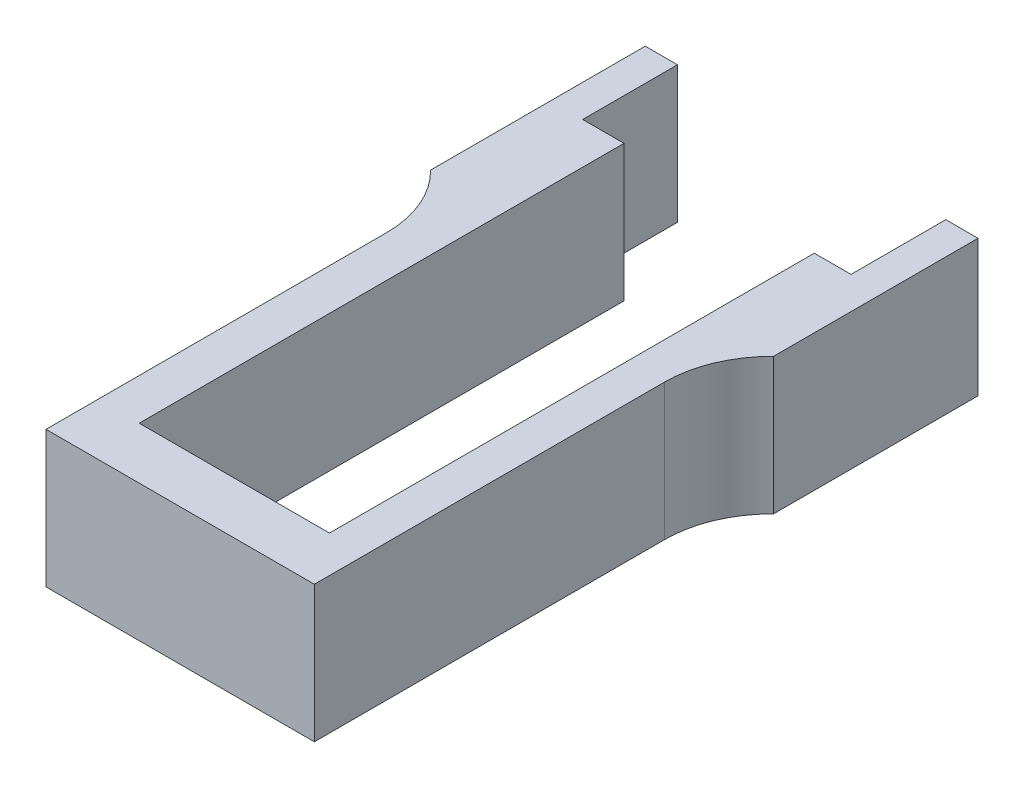
ISO-10303-21;
HEADER;
FILE_DESCRIPTION(('STEP AP214'),'2;1');
FILE_NAME('part.step','',(''),(''),'','','');
FILE_SCHEMA(('AUTOMOTIVE_DESIGN { 1 0 10303 214 1 1 1 1 }'));
ENDSEC;
DATA;
#1=APPLICATION_CONTEXT('core data for automotive mechanical design processes');
#2=APPLICATION_PROTOCOL_DEFINITION('international standard','automotive_design',2000,#1);
#3=PRODUCT_CONTEXT('',#1,'mechanical');
#4=PRODUCT('Part','Part','',(#3));
#5=PRODUCT_RELATED_PRODUCT_CATEGORY('part','',(#4));
#6=PRODUCT_DEFINITION_FORMATION('','',#4);
#7=PRODUCT_DEFINITION_CONTEXT('part definition',#1,'design');
#8=PRODUCT_DEFINITION('design','',#6,#7);
#9=PRODUCT_DEFINITION_SHAPE('','',#8);
#10=(LENGTH_UNIT() NAMED_UNIT(*) SI_UNIT(.MILLI.,.METRE.));
#11=(NAMED_UNIT(*) PLANE_ANGLE_UNIT() SI_UNIT($,.RADIAN.));
#12=(NAMED_UNIT(*) SI_UNIT($,.STERADIAN.) SOLID_ANGLE_UNIT());
#13=UNCERTAINTY_MEASURE_WITH_UNIT(LENGTH_MEASURE(1.E-05),#10,'distance_accuracy_value','');
#14=(GEOMETRIC_REPRESENTATION_CONTEXT(3) GLOBAL_UNCERTAINTY_ASSIGNED_CONTEXT((#13)) GLOBAL_UNIT_ASSIGNED_CONTEXT((#10,
#11,#12)) REPRESENTATION_CONTEXT('',''));
#15=CARTESIAN_POINT('',(0.,0.,0.));
#16=DIRECTION('',(0.,0.,1.));
#17=DIRECTION('',(1.,0.,0.));
#18=AXIS2_PLACEMENT_3D('',#15,#16,#17);
#19=CARTESIAN_POINT('',(-25.,85.5059963359212,50.));
#20=DIRECTION('',(1.,0.,0.));
#21=DIRECTION('',(0.,0.,-1.));
#22=AXIS2_PLACEMENT_3D('',#19,#20,#21);
#23=PLANE('',#22);
#24=DIRECTION('',(0.,0.,-1.));
#25=VECTOR('',#24,1.);
#26=CARTESIAN_POINT('',(-25.,85.5059963359212,50.));
#27=LINE('',#26,#25);
#28=CARTESIAN_POINT('',(-25.,85.5059963359212,50.));
#29=VERTEX_POINT('',#28);
#30=CARTESIAN_POINT('',(-25.,85.5059963359212,18.3118382249067));
#31=VERTEX_POINT('',#30);
#32=EDGE_CURVE('E255',#29,#31,#27,.T.);
#33=ORIENTED_EDGE('',*,*,#32,.T.);
#34=DIRECTION('',(0.,-1.,0.));
#35=VECTOR('',#34,1.);
#36=CARTESIAN_POINT('',(-25.,85.5059963359212,18.3118382249067));
#37=LINE('',#36,#35);
#38=CARTESIAN_POINT('',(-25.,72.7910580922369,18.3118382249067));
#39=VERTEX_POINT('',#38);
#40=EDGE_CURVE('E55',#31,#39,#37,.T.);
#41=ORIENTED_EDGE('',*,*,#40,.T.);
#42=DIRECTION('',(0.,0.,-1.));
#43=VECTOR('',#42,1.);
#44=CARTESIAN_POINT('',(-25.,72.7910580922369,50.));
#45=LINE('',#44,#43);
#46=CARTESIAN_POINT('',(-25.,72.7910580922369,50.));
#47=VERTEX_POINT('',#46);
#48=EDGE_CURVE('E253',#47,#39,#45,.T.);
#49=ORIENTED_EDGE('',*,*,#48,.F.);
#50=DIRECTION('',(0.,-1.,0.));
#51=VECTOR('',#50,1.);
#52=CARTESIAN_POINT('',(-25.,85.5059963359212,50.));
#53=LINE('',#52,#51);
#54=EDGE_CURVE('E236',#29,#47,#53,.T.);
#55=ORIENTED_EDGE('',*,*,#54,.F.);
#56=EDGE_LOOP('',(#33,#41,#49,#55));
#57=FACE_BOUND('',#56,.T.);
#58=ADVANCED_FACE('F34',(#57),#23,.F.);
#59=CARTESIAN_POINT('',(-21.15,85.5059963359212,50.));
#60=DIRECTION('',(-1.,0.,0.));
#61=DIRECTION('',(0.,0.,1.));
#62=AXIS2_PLACEMENT_3D('',#59,#60,#61);
#63=PLANE('',#62);
#64=DIRECTION('',(0.,1.,0.));
#65=VECTOR('',#64,1.);
#66=CARTESIAN_POINT('',(-21.15,18.5018096170554,45.165463377119));
#67=LINE('',#66,#65);
#68=CARTESIAN_POINT('',(-21.15,72.7910580922369,45.165463377119));
#69=VERTEX_POINT('',#68);
#70=CARTESIAN_POINT('',(-21.15,85.5059963359212,45.165463377119));
#71=VERTEX_POINT('',#70);
#72=EDGE_CURVE('E204',#69,#71,#67,.T.);
#73=ORIENTED_EDGE('',*,*,#72,.F.);
#74=DIRECTION('',(0.,0.,-1.));
#75=VECTOR('',#74,1.);
#76=CARTESIAN_POINT('',(-21.15,72.7910580922369,50.));
#77=LINE('',#76,#75);
#78=CARTESIAN_POINT('',(-21.15,72.7910580922369,0.));
#79=VERTEX_POINT('',#78);
#80=EDGE_CURVE('E242',#69,#79,#77,.T.);
#81=ORIENTED_EDGE('',*,*,#80,.T.);
#82=DIRECTION('',(0.,1.,0.));
#83=VECTOR('',#82,1.);
#84=CARTESIAN_POINT('',(-21.15,85.5059963359212,0.));
#85=LINE('',#84,#83);
#86=CARTESIAN_POINT('',(-21.15,85.5059963359212,0.));
#87=VERTEX_POINT('',#86);
#88=EDGE_CURVE('E210',#79,#87,#85,.T.);
#89=ORIENTED_EDGE('',*,*,#88,.T.);
#90=DIRECTION('',(0.,0.,-1.));
#91=VECTOR('',#90,1.);
#92=CARTESIAN_POINT('',(-21.15,85.5059963359212,50.));
#93=LINE('',#92,#91);
#94=EDGE_CURVE('E257',#71,#87,#93,.T.);
#95=ORIENTED_EDGE('',*,*,#94,.F.);
#96=EDGE_LOOP('',(#73,#81,#89,#95));
#97=FACE_BOUND('',#96,.T.);
#98=ADVANCED_FACE('F302',(#97),#63,.F.);
#99=CARTESIAN_POINT('',(-21.15,85.5059963359212,50.));
#100=DIRECTION('',(0.,-1.,0.));
#101=DIRECTION('',(0.,0.,-1.));
#102=AXIS2_PLACEMENT_3D('',#99,#100,#101);
#103=PLANE('',#102);
#104=DIRECTION('',(-1.,0.,0.));
#105=VECTOR('',#104,1.);
#106=CARTESIAN_POINT('',(-21.15,85.5059963359212,0.));
#107=LINE('',#106,#105);
#108=CARTESIAN_POINT('',(-25.,85.5059963359212,0.));
#109=VERTEX_POINT('',#108);
#110=EDGE_CURVE('E245',#87,#109,#107,.T.);
#111=ORIENTED_EDGE('',*,*,#110,.T.);
#112=DIRECTION('',(0.,0.,-1.));
#113=VECTOR('',#112,1.);
#114=CARTESIAN_POINT('',(-25.,85.5059963359212,11.1704097963639));
#115=LINE('',#114,#113);
#116=CARTESIAN_POINT('',(-25.,85.5059963359212,-8.82878840608599));
#117=VERTEX_POINT('',#116);
#118=EDGE_CURVE('E171',#109,#117,#115,.T.);
#119=ORIENTED_EDGE('',*,*,#118,.T.);
#120=DIRECTION('',(1.,0.,0.));
#121=VECTOR('',#120,1.);
#122=CARTESIAN_POINT('',(-28.,85.5059963359212,-8.82878840608599));
#123=LINE('',#122,#121);
#124=CARTESIAN_POINT('',(-28.,85.5059963359212,-8.82878840608599));
#125=VERTEX_POINT('',#124);
#126=EDGE_CURVE('E153',#125,#117,#123,.T.);
#127=ORIENTED_EDGE('',*,*,#126,.F.);
#128=DIRECTION('',(0.,0.,-1.));
#129=VECTOR('',#128,1.);
#130=CARTESIAN_POINT('',(-28.,85.5059963359212,11.1704097963639));
#131=LINE('',#130,#129);
#132=CARTESIAN_POINT('',(-28.,85.5059963359212,11.1704097963639));
#133=VERTEX_POINT('',#132);
#134=EDGE_CURVE('E150',#133,#125,#131,.T.);
#135=ORIENTED_EDGE('',*,*,#134,.F.);
#136=CARTESIAN_POINT('',(-35.,85.5059963359212,18.3118382249067));
#137=DIRECTION('',(0.,-1.,0.));
#138=DIRECTION('',(0.,0.,-1.));
#139=AXIS2_PLACEMENT_3D('',#136,#137,#138);
#140=CIRCLE('',#139,10.);
#141=EDGE_CURVE('E42',#133,#31,#140,.T.);
#142=ORIENTED_EDGE('',*,*,#141,.T.);
#143=ORIENTED_EDGE('',*,*,#32,.F.);
#144=DIRECTION('',(-1.,0.,0.));
#145=VECTOR('',#144,1.);
#146=CARTESIAN_POINT('',(-21.15,85.5059963359212,50.));
#147=LINE('',#146,#145);
#148=CARTESIAN_POINT('',(0.,85.5059963359212,50.));
#149=VERTEX_POINT('',#148);
#150=EDGE_CURVE('E234',#149,#29,#147,.T.);
#151=ORIENTED_EDGE('',*,*,#150,.F.);
#152=DIRECTION('',(0.,0.,-1.));
#153=VECTOR('',#152,1.);
#154=CARTESIAN_POINT('',(0.,85.5059963359212,0.));
#155=LINE('',#154,#153);
#156=CARTESIAN_POINT('',(0.,85.5059963359212,17.3650919120413));
#157=VERTEX_POINT('',#156);
#158=EDGE_CURVE('E200',#149,#157,#155,.T.);
#159=ORIENTED_EDGE('',*,*,#158,.T.);
#160=CARTESIAN_POINT('',(10.,85.5059963359212,17.3650919120413));
#161=DIRECTION('',(0.,-1.,0.));
#162=DIRECTION('',(0.,0.,-1.));
#163=AXIS2_PLACEMENT_3D('',#160,#161,#162);
#164=CIRCLE('',#163,10.);
#165=CARTESIAN_POINT('',(3.,85.5059963359212,10.2236634834984));
#166=VERTEX_POINT('',#165);
#167=EDGE_CURVE('E263',#157,#166,#164,.T.);
#168=ORIENTED_EDGE('',*,*,#167,.T.);
#169=DIRECTION('',(0.,0.,1.));
#170=VECTOR('',#169,1.);
#171=CARTESIAN_POINT('',(3.,85.5059963359212,10.2236634834984));
#172=LINE('',#171,#170);
#173=CARTESIAN_POINT('',(3.,85.5059963359212,-8.82878840608599));
#174=VERTEX_POINT('',#173);
#175=EDGE_CURVE('E186',#174,#166,#172,.T.);
#176=ORIENTED_EDGE('',*,*,#175,.F.);
#177=DIRECTION('',(-1.,0.,0.));
#178=VECTOR('',#177,1.);
#179=CARTESIAN_POINT('',(3.,85.5059963359212,-8.82878840608599));
#180=LINE('',#179,#178);
#181=CARTESIAN_POINT('',(0.,85.5059963359212,-8.82878840608599));
#182=VERTEX_POINT('',#181);
#183=EDGE_CURVE('E189',#174,#182,#180,.T.);
#184=ORIENTED_EDGE('',*,*,#183,.T.);
#185=DIRECTION('',(0.,0.,1.));
#186=VECTOR('',#185,1.);
#187=CARTESIAN_POINT('',(0.,85.5059963359212,10.2236634834984));
#188=LINE('',#187,#186);
#189=CARTESIAN_POINT('',(0.,85.5059963359212,0.));
#190=VERTEX_POINT('',#189);
#191=EDGE_CURVE('E182',#182,#190,#188,.T.);
#192=ORIENTED_EDGE('',*,*,#191,.T.);
#193=DIRECTION('',(-1.,0.,0.));
#194=VECTOR('',#193,1.);
#195=CARTESIAN_POINT('',(-3.42398491001024,85.5059963359212,0.));
#196=LINE('',#195,#194);
#197=CARTESIAN_POINT('',(-3.42398491001024,85.5059963359212,0.));
#198=VERTEX_POINT('',#197);
#199=EDGE_CURVE('E213',#190,#198,#196,.T.);
#200=ORIENTED_EDGE('',*,*,#199,.T.);
#201=DIRECTION('',(0.,0.,1.));
#202=VECTOR('',#201,1.);
#203=CARTESIAN_POINT('',(-3.42398491001021,85.5059963359212,45.165463377119));
#204=LINE('',#203,#202);
#205=CARTESIAN_POINT('',(-3.42398491001021,85.5059963359212,45.165463377119));
#206=VERTEX_POINT('',#205);
#207=EDGE_CURVE('E216',#198,#206,#204,.T.);
#208=ORIENTED_EDGE('',*,*,#207,.T.);
#209=DIRECTION('',(-1.,0.,0.));
#210=VECTOR('',#209,1.);
#211=CARTESIAN_POINT('',(-21.15,85.5059963359212,45.165463377119));
#212=LINE('',#211,#210);
#213=EDGE_CURVE('E219',#206,#71,#212,.T.);
#214=ORIENTED_EDGE('',*,*,#213,.T.);
#215=ORIENTED_EDGE('',*,*,#94,.T.);
#216=EDGE_LOOP('',(#111,#119,#127,#135,#142,#143,#151,#159,#168,#176,#184,#192,#200,#208,#214,#215));
#217=FACE_BOUND('',#216,.T.);
#218=ADVANCED_FACE('F151',(#217),#103,.F.);
#219=CARTESIAN_POINT('',(-21.15,72.7910580922369,50.));
#220=DIRECTION('',(0.,1.,0.));
#221=DIRECTION('',(0.,0.,1.));
#222=AXIS2_PLACEMENT_3D('',#219,#220,#221);
#223=PLANE('',#222);
#224=DIRECTION('',(1.,0.,0.));
#225=VECTOR('',#224,1.);
#226=CARTESIAN_POINT('',(-21.15,72.7910580922369,0.));
#227=LINE('',#226,#225);
#228=CARTESIAN_POINT('',(-25.,72.7910580922369,0.));
#229=VERTEX_POINT('',#228);
#230=EDGE_CURVE('E237',#229,#79,#227,.T.);
#231=ORIENTED_EDGE('',*,*,#230,.T.);
#232=ORIENTED_EDGE('',*,*,#80,.F.);
#233=DIRECTION('',(1.,0.,0.));
#234=VECTOR('',#233,1.);
#235=CARTESIAN_POINT('',(-21.15,72.7910580922369,45.165463377119));
#236=LINE('',#235,#234);
#237=CARTESIAN_POINT('',(-3.42398491001021,72.7910580922369,45.165463377119));
#238=VERTEX_POINT('',#237);
#239=EDGE_CURVE('E208',#69,#238,#236,.T.);
#240=ORIENTED_EDGE('',*,*,#239,.T.);
#241=DIRECTION('',(0.,0.,-1.));
#242=VECTOR('',#241,1.);
#243=CARTESIAN_POINT('',(-3.42398491001021,72.7910580922369,45.165463377119));
#244=LINE('',#243,#242);
#245=CARTESIAN_POINT('',(-3.42398491001024,72.7910580922369,0.));
#246=VERTEX_POINT('',#245);
#247=EDGE_CURVE('E206',#238,#246,#244,.T.);
#248=ORIENTED_EDGE('',*,*,#247,.T.);
#249=DIRECTION('',(1.,0.,0.));
#250=VECTOR('',#249,1.);
#251=CARTESIAN_POINT('',(-3.42398491001024,72.7910580922369,0.));
#252=LINE('',#251,#250);
#253=CARTESIAN_POINT('',(0.,72.7910580922369,0.));
#254=VERTEX_POINT('',#253);
#255=EDGE_CURVE('E203',#246,#254,#252,.T.);
#256=ORIENTED_EDGE('',*,*,#255,.T.);
#257=DIRECTION('',(0.,0.,-1.));
#258=VECTOR('',#257,1.);
#259=CARTESIAN_POINT('',(0.,72.7910580922369,10.2236634834984));
#260=LINE('',#259,#258);
#261=CARTESIAN_POINT('',(0.,72.7910580922369,-8.82878840608599));
#262=VERTEX_POINT('',#261);
#263=EDGE_CURVE('E177',#254,#262,#260,.T.);
#264=ORIENTED_EDGE('',*,*,#263,.T.);
#265=DIRECTION('',(-1.,0.,0.));
#266=VECTOR('',#265,1.);
#267=CARTESIAN_POINT('',(3.,72.7910580922369,-8.82878840608599));
#268=LINE('',#267,#266);
#269=CARTESIAN_POINT('',(3.,72.7910580922369,-8.82878840608599));
#270=VERTEX_POINT('',#269);
#271=EDGE_CURVE('E197',#270,#262,#268,.T.);
#272=ORIENTED_EDGE('',*,*,#271,.F.);
#273=DIRECTION('',(0.,0.,-1.));
#274=VECTOR('',#273,1.);
#275=CARTESIAN_POINT('',(3.,72.7910580922369,10.2236634834984));
#276=LINE('',#275,#274);
#277=CARTESIAN_POINT('',(3.,72.7910580922369,10.2236634834984));
#278=VERTEX_POINT('',#277);
#279=EDGE_CURVE('E181',#278,#270,#276,.T.);
#280=ORIENTED_EDGE('',*,*,#279,.F.);
#281=CARTESIAN_POINT('',(10.,72.7910580922369,17.3650919120413));
#282=DIRECTION('',(0.,1.,0.));
#283=DIRECTION('',(0.,0.,1.));
#284=AXIS2_PLACEMENT_3D('',#281,#282,#283);
#285=CIRCLE('',#284,10.);
#286=CARTESIAN_POINT('',(0.,72.7910580922369,17.3650919120413));
#287=VERTEX_POINT('',#286);
#288=EDGE_CURVE('E261',#278,#287,#285,.T.);
#289=ORIENTED_EDGE('',*,*,#288,.T.);
#290=DIRECTION('',(0.,0.,1.));
#291=VECTOR('',#290,1.);
#292=CARTESIAN_POINT('',(0.,72.7910580922369,0.));
#293=LINE('',#292,#291);
#294=CARTESIAN_POINT('',(0.,72.7910580922369,50.));
#295=VERTEX_POINT('',#294);
#296=EDGE_CURVE('E201',#287,#295,#293,.T.);
#297=ORIENTED_EDGE('',*,*,#296,.T.);
#298=DIRECTION('',(1.,0.,0.));
#299=VECTOR('',#298,1.);
#300=CARTESIAN_POINT('',(-21.15,72.7910580922369,50.));
#301=LINE('',#300,#299);
#302=EDGE_CURVE('E239',#47,#295,#301,.T.);
#303=ORIENTED_EDGE('',*,*,#302,.F.);
#304=ORIENTED_EDGE('',*,*,#48,.T.);
#305=CARTESIAN_POINT('',(-35.,72.7910580922369,18.3118382249067));
#306=DIRECTION('',(0.,1.,0.));
#307=DIRECTION('',(0.,0.,1.));
#308=AXIS2_PLACEMENT_3D('',#305,#306,#307);
#309=CIRCLE('',#308,10.);
#310=CARTESIAN_POINT('',(-28.,72.7910580922369,11.1704097963639));
#311=VERTEX_POINT('',#310);
#312=EDGE_CURVE('E11',#39,#311,#309,.T.);
#313=ORIENTED_EDGE('',*,*,#312,.T.);
#314=DIRECTION('',(0.,0.,1.));
#315=VECTOR('',#314,1.);
#316=CARTESIAN_POINT('',(-28.,72.7910580922369,11.1704097963639));
#317=LINE('',#316,#315);
#318=CARTESIAN_POINT('',(-28.,72.7910580922369,-8.82878840608599));
#319=VERTEX_POINT('',#318);
#320=EDGE_CURVE('E161',#319,#311,#317,.T.);
#321=ORIENTED_EDGE('',*,*,#320,.F.);
#322=DIRECTION('',(1.,0.,0.));
#323=VECTOR('',#322,1.);
#324=CARTESIAN_POINT('',(-28.,72.7910580922369,-8.82878840608599));
#325=LINE('',#324,#323);
#326=CARTESIAN_POINT('',(-25.,72.7910580922369,-8.82878840608599));
#327=VERTEX_POINT('',#326);
#328=EDGE_CURVE('E170',#319,#327,#325,.T.);
#329=ORIENTED_EDGE('',*,*,#328,.T.);
#330=DIRECTION('',(0.,0.,1.));
#331=VECTOR('',#330,1.);
#332=CARTESIAN_POINT('',(-25.,72.7910580922369,11.1704097963639));
#333=LINE('',#332,#331);
#334=EDGE_CURVE('E162',#327,#229,#333,.T.);
#335=ORIENTED_EDGE('',*,*,#334,.T.);
#336=EDGE_LOOP('',(#231,#232,#240,#248,#256,#264,#272,#280,#289,#297,#303,#304,#313,#321,#329,#335));
#337=FACE_BOUND('',#336,.T.);
#338=ADVANCED_FACE('F280',(#337),#223,.F.);
#339=CARTESIAN_POINT('',(0.,0.,50.));
#340=DIRECTION('',(0.,0.,-1.));
#341=DIRECTION('',(-1.,0.,0.));
#342=AXIS2_PLACEMENT_3D('',#339,#340,#341);
#343=PLANE('',#342);
#344=ORIENTED_EDGE('',*,*,#302,.T.);
#345=DIRECTION('',(0.,1.,0.));
#346=VECTOR('',#345,1.);
#347=CARTESIAN_POINT('',(0.,18.5018096170554,50.));
#348=LINE('',#347,#346);
#349=EDGE_CURVE('E222',#295,#149,#348,.T.);
#350=ORIENTED_EDGE('',*,*,#349,.T.);
#351=ORIENTED_EDGE('',*,*,#150,.T.);
#352=ORIENTED_EDGE('',*,*,#54,.T.);
#353=EDGE_LOOP('',(#344,#350,#351,#352));
#354=FACE_BOUND('',#353,.T.);
#355=ADVANCED_FACE('F359',(#354),#343,.F.);
#356=CARTESIAN_POINT('',(0.,0.,0.));
#357=DIRECTION('',(0.,0.,-1.));
#358=DIRECTION('',(-1.,0.,0.));
#359=AXIS2_PLACEMENT_3D('',#356,#357,#358);
#360=PLANE('',#359);
#361=ORIENTED_EDGE('',*,*,#88,.F.);
#362=ORIENTED_EDGE('',*,*,#230,.F.);
#363=DIRECTION('',(0.,-1.,0.));
#364=VECTOR('',#363,1.);
#365=CARTESIAN_POINT('',(-25.,85.5059963359212,0.));
#366=LINE('',#365,#364);
#367=EDGE_CURVE('E247',#109,#229,#366,.T.);
#368=ORIENTED_EDGE('',*,*,#367,.F.);
#369=ORIENTED_EDGE('',*,*,#110,.F.);
#370=EDGE_LOOP('',(#361,#362,#368,#369));
#371=FACE_BOUND('',#370,.T.);
#372=ADVANCED_FACE('F309',(#371),#360,.T.);
#373=CARTESIAN_POINT('',(-21.15,18.5018096170554,45.165463377119));
#374=DIRECTION('',(0.,0.,-1.));
#375=DIRECTION('',(-1.,0.,0.));
#376=AXIS2_PLACEMENT_3D('',#373,#374,#375);
#377=PLANE('',#376);
#378=ORIENTED_EDGE('',*,*,#239,.F.);
#379=ORIENTED_EDGE('',*,*,#72,.T.);
#380=ORIENTED_EDGE('',*,*,#213,.F.);
#381=DIRECTION('',(0.,1.,0.));
#382=VECTOR('',#381,1.);
#383=CARTESIAN_POINT('',(-3.42398491001021,18.5018096170554,45.165463377119));
#384=LINE('',#383,#382);
#385=EDGE_CURVE('E225',#238,#206,#384,.T.);
#386=ORIENTED_EDGE('',*,*,#385,.F.);
#387=EDGE_LOOP('',(#378,#379,#380,#386));
#388=FACE_BOUND('',#387,.T.);
#389=ADVANCED_FACE('F299',(#388),#377,.T.);
#390=CARTESIAN_POINT('',(-3.42398491001021,18.5018096170554,45.165463377119));
#391=DIRECTION('',(-1.,0.,0.));
#392=DIRECTION('',(0.,0.,1.));
#393=AXIS2_PLACEMENT_3D('',#390,#391,#392);
#394=PLANE('',#393);
#395=ORIENTED_EDGE('',*,*,#247,.F.);
#396=ORIENTED_EDGE('',*,*,#385,.T.);
#397=ORIENTED_EDGE('',*,*,#207,.F.);
#398=DIRECTION('',(0.,1.,0.));
#399=VECTOR('',#398,1.);
#400=CARTESIAN_POINT('',(-3.42398491001024,18.5018096170554,0.));
#401=LINE('',#400,#399);
#402=EDGE_CURVE('E227',#246,#198,#401,.T.);
#403=ORIENTED_EDGE('',*,*,#402,.F.);
#404=EDGE_LOOP('',(#395,#396,#397,#403));
#405=FACE_BOUND('',#404,.T.);
#406=ADVANCED_FACE('F351',(#405),#394,.T.);
#407=CARTESIAN_POINT('',(-3.42398491001024,18.5018096170554,0.));
#408=DIRECTION('',(0.,0.,-1.));
#409=DIRECTION('',(-1.,0.,0.));
#410=AXIS2_PLACEMENT_3D('',#407,#408,#409);
#411=PLANE('',#410);
#412=ORIENTED_EDGE('',*,*,#255,.F.);
#413=ORIENTED_EDGE('',*,*,#402,.T.);
#414=ORIENTED_EDGE('',*,*,#199,.F.);
#415=DIRECTION('',(0.,1.,0.));
#416=VECTOR('',#415,1.);
#417=CARTESIAN_POINT('',(0.,18.5018096170554,0.));
#418=LINE('',#417,#416);
#419=EDGE_CURVE('E229',#254,#190,#418,.T.);
#420=ORIENTED_EDGE('',*,*,#419,.F.);
#421=EDGE_LOOP('',(#412,#413,#414,#420));
#422=FACE_BOUND('',#421,.T.);
#423=ADVANCED_FACE('F291',(#422),#411,.T.);
#424=CARTESIAN_POINT('',(0.,18.5018096170554,0.));
#425=DIRECTION('',(1.,0.,0.));
#426=DIRECTION('',(0.,0.,-1.));
#427=AXIS2_PLACEMENT_3D('',#424,#425,#426);
#428=PLANE('',#427);
#429=ORIENTED_EDGE('',*,*,#296,.F.);
#430=DIRECTION('',(0.,1.,0.));
#431=VECTOR('',#430,1.);
#432=CARTESIAN_POINT('',(0.,85.5059963359212,17.3650919120413));
#433=LINE('',#432,#431);
#434=EDGE_CURVE('E259',#287,#157,#433,.T.);
#435=ORIENTED_EDGE('',*,*,#434,.T.);
#436=ORIENTED_EDGE('',*,*,#158,.F.);
#437=ORIENTED_EDGE('',*,*,#349,.F.);
#438=EDGE_LOOP('',(#429,#435,#436,#437));
#439=FACE_BOUND('',#438,.T.);
#440=ADVANCED_FACE('F347',(#439),#428,.T.);
#441=CARTESIAN_POINT('',(0.,0.,0.));
#442=DIRECTION('',(1.,0.,0.));
#443=DIRECTION('',(0.,0.,-1.));
#444=AXIS2_PLACEMENT_3D('',#441,#442,#443);
#445=PLANE('',#444);
#446=ORIENTED_EDGE('',*,*,#263,.F.);
#447=ORIENTED_EDGE('',*,*,#419,.T.);
#448=ORIENTED_EDGE('',*,*,#191,.F.);
#449=DIRECTION('',(0.,1.,0.));
#450=VECTOR('',#449,1.);
#451=CARTESIAN_POINT('',(0.,85.5059963359212,-8.82878840608599));
#452=LINE('',#451,#450);
#453=EDGE_CURVE('E191',#262,#182,#452,.T.);
#454=ORIENTED_EDGE('',*,*,#453,.F.);
#455=EDGE_LOOP('',(#446,#447,#448,#454));
#456=FACE_BOUND('',#455,.T.);
#457=ADVANCED_FACE('F287',(#456),#445,.F.);
#458=CARTESIAN_POINT('',(3.,85.5059963359212,-8.82878840608599));
#459=DIRECTION('',(0.,0.,1.));
#460=DIRECTION('',(1.,0.,0.));
#461=AXIS2_PLACEMENT_3D('',#458,#459,#460);
#462=PLANE('',#461);
#463=ORIENTED_EDGE('',*,*,#453,.T.);
#464=ORIENTED_EDGE('',*,*,#183,.F.);
#465=DIRECTION('',(0.,1.,0.));
#466=VECTOR('',#465,1.);
#467=CARTESIAN_POINT('',(3.,85.5059963359212,-8.82878840608599));
#468=LINE('',#467,#466);
#469=EDGE_CURVE('E184',#270,#174,#468,.T.);
#470=ORIENTED_EDGE('',*,*,#469,.F.);
#471=ORIENTED_EDGE('',*,*,#271,.T.);
#472=EDGE_LOOP('',(#463,#464,#470,#471));
#473=FACE_BOUND('',#472,.T.);
#474=ADVANCED_FACE('F284',(#473),#462,.F.);
#475=CARTESIAN_POINT('',(3.,0.,0.));
#476=DIRECTION('',(1.,0.,0.));
#477=DIRECTION('',(0.,0.,-1.));
#478=AXIS2_PLACEMENT_3D('',#475,#476,#477);
#479=PLANE('',#478);
#480=DIRECTION('',(0.,-1.,0.));
#481=VECTOR('',#480,1.);
#482=CARTESIAN_POINT('',(3.,85.5059963359212,10.2236634834984));
#483=LINE('',#482,#481);
#484=EDGE_CURVE('E178',#166,#278,#483,.T.);
#485=ORIENTED_EDGE('',*,*,#484,.T.);
#486=ORIENTED_EDGE('',*,*,#279,.T.);
#487=ORIENTED_EDGE('',*,*,#469,.T.);
#488=ORIENTED_EDGE('',*,*,#175,.T.);
#489=EDGE_LOOP('',(#485,#486,#487,#488));
#490=FACE_BOUND('',#489,.T.);
#491=ADVANCED_FACE('F272',(#490),#479,.T.);
#492=CARTESIAN_POINT('',(10.,85.5059963359212,17.3650919120413));
#493=DIRECTION('',(0.,-1.,0.));
#494=DIRECTION('',(0.,0.,-1.));
#495=AXIS2_PLACEMENT_3D('',#492,#493,#494);
#496=CYLINDRICAL_SURFACE('',#495,10.);
#497=ORIENTED_EDGE('',*,*,#167,.F.);
#498=ORIENTED_EDGE('',*,*,#434,.F.);
#499=ORIENTED_EDGE('',*,*,#288,.F.);
#500=ORIENTED_EDGE('',*,*,#484,.F.);
#501=EDGE_LOOP('',(#497,#498,#499,#500));
#502=FACE_BOUND('',#501,.T.);
#503=ADVANCED_FACE('F275',(#502),#496,.F.);
#504=CARTESIAN_POINT('',(-28.,85.5059963359212,-8.82878840608599));
#505=DIRECTION('',(0.,0.,1.));
#506=DIRECTION('',(1.,0.,0.));
#507=AXIS2_PLACEMENT_3D('',#504,#505,#506);
#508=PLANE('',#507);
#509=DIRECTION('',(0.,-1.,0.));
#510=VECTOR('',#509,1.);
#511=CARTESIAN_POINT('',(-25.,85.5059963359212,-8.82878840608599));
#512=LINE('',#511,#510);
#513=EDGE_CURVE('E165',#117,#327,#512,.T.);
#514=ORIENTED_EDGE('',*,*,#513,.T.);
#515=ORIENTED_EDGE('',*,*,#328,.F.);
#516=DIRECTION('',(0.,-1.,0.));
#517=VECTOR('',#516,1.);
#518=CARTESIAN_POINT('',(-28.,85.5059963359212,-8.82878840608599));
#519=LINE('',#518,#517);
#520=EDGE_CURVE('E156',#125,#319,#519,.T.);
#521=ORIENTED_EDGE('',*,*,#520,.F.);
#522=ORIENTED_EDGE('',*,*,#126,.T.);
#523=EDGE_LOOP('',(#514,#515,#521,#522));
#524=FACE_BOUND('',#523,.T.);
#525=ADVANCED_FACE('F314',(#524),#508,.F.);
#526=CARTESIAN_POINT('',(-28.,0.,0.));
#527=DIRECTION('',(1.,0.,0.));
#528=DIRECTION('',(0.,0.,-1.));
#529=AXIS2_PLACEMENT_3D('',#526,#527,#528);
#530=PLANE('',#529);
#531=DIRECTION('',(0.,1.,0.));
#532=VECTOR('',#531,1.);
#533=CARTESIAN_POINT('',(-28.,85.5059963359212,11.1704097963639));
#534=LINE('',#533,#532);
#535=EDGE_CURVE('E148',#311,#133,#534,.T.);
#536=ORIENTED_EDGE('',*,*,#535,.T.);
#537=ORIENTED_EDGE('',*,*,#134,.T.);
#538=ORIENTED_EDGE('',*,*,#520,.T.);
#539=ORIENTED_EDGE('',*,*,#320,.T.);
#540=EDGE_LOOP('',(#536,#537,#538,#539));
#541=FACE_BOUND('',#540,.T.);
#542=ADVANCED_FACE('F159',(#541),#530,.F.);
#543=CARTESIAN_POINT('',(-25.,0.,0.));
#544=DIRECTION('',(1.,0.,0.));
#545=DIRECTION('',(0.,0.,-1.));
#546=AXIS2_PLACEMENT_3D('',#543,#544,#545);
#547=PLANE('',#546);
#548=ORIENTED_EDGE('',*,*,#118,.F.);
#549=ORIENTED_EDGE('',*,*,#367,.T.);
#550=ORIENTED_EDGE('',*,*,#334,.F.);
#551=ORIENTED_EDGE('',*,*,#513,.F.);
#552=EDGE_LOOP('',(#548,#549,#550,#551));
#553=FACE_BOUND('',#552,.T.);
#554=ADVANCED_FACE('F316',(#553),#547,.T.);
#555=CARTESIAN_POINT('',(-35.,85.5059963359212,18.3118382249067));
#556=DIRECTION('',(0.,-1.,0.));
#557=DIRECTION('',(0.,0.,-1.));
#558=AXIS2_PLACEMENT_3D('',#555,#556,#557);
#559=CYLINDRICAL_SURFACE('',#558,10.);
#560=ORIENTED_EDGE('',*,*,#312,.F.);
#561=ORIENTED_EDGE('',*,*,#40,.F.);
#562=ORIENTED_EDGE('',*,*,#141,.F.);
#563=ORIENTED_EDGE('',*,*,#535,.F.);
#564=EDGE_LOOP('',(#560,#561,#562,#563));
#565=FACE_BOUND('',#564,.T.);
#566=ADVANCED_FACE('F36',(#565),#559,.F.);
#567=CLOSED_SHELL('',(#58,#98,#218,#338,#355,#372,#389,#406,#423,#440,#457,#474,#491,#503,#525,
#542,#554,#566));
#568=MANIFOLD_SOLID_BREP('B2',#567);
#569=ADVANCED_BREP_SHAPE_REPRESENTATION('',(#18,#568),#14);
#570=SHAPE_DEFINITION_REPRESENTATION(#9,#569);
ENDSEC;
END-ISO-10303-21;
